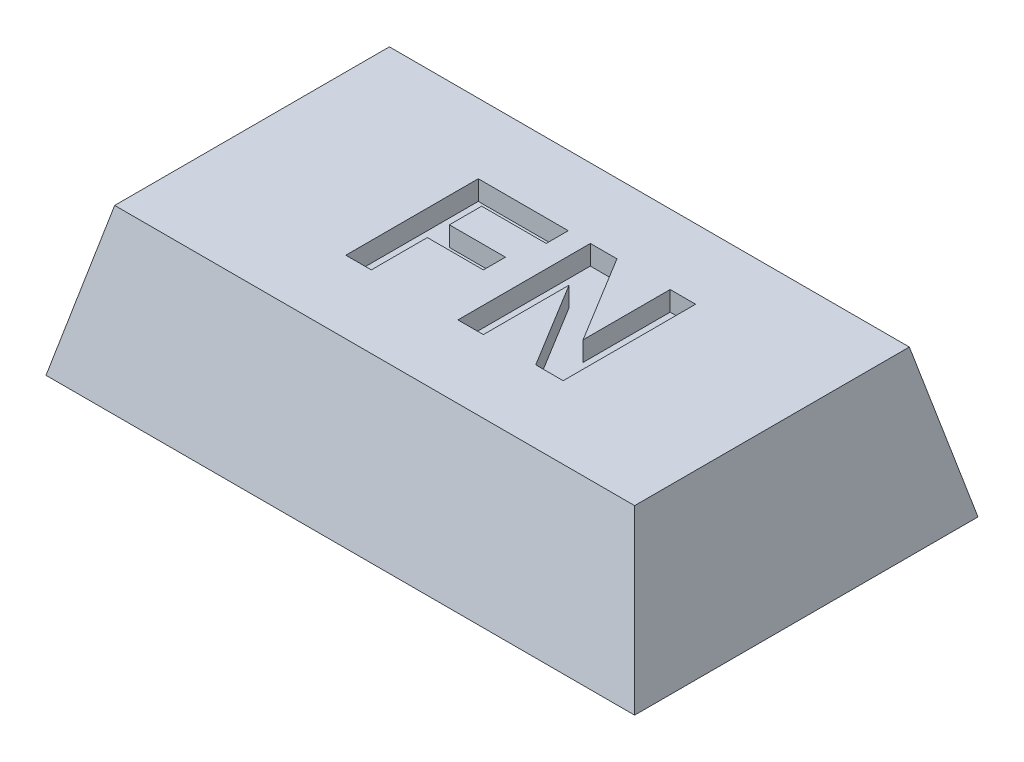
ISO-10303-21;
HEADER;
FILE_DESCRIPTION(('STEP AP214'),'2;1');
FILE_NAME('part.step','',(''),(''),'','','');
FILE_SCHEMA(('AUTOMOTIVE_DESIGN { 1 0 10303 214 1 1 1 1 }'));
ENDSEC;
DATA;
#1=APPLICATION_CONTEXT('core data for automotive mechanical design processes');
#2=APPLICATION_PROTOCOL_DEFINITION('international standard','automotive_design',2000,#1);
#3=PRODUCT_CONTEXT('',#1,'mechanical');
#4=PRODUCT('Part','Part','',(#3));
#5=PRODUCT_RELATED_PRODUCT_CATEGORY('part','',(#4));
#6=PRODUCT_DEFINITION_FORMATION('','',#4);
#7=PRODUCT_DEFINITION_CONTEXT('part definition',#1,'design');
#8=PRODUCT_DEFINITION('design','',#6,#7);
#9=PRODUCT_DEFINITION_SHAPE('','',#8);
#10=(LENGTH_UNIT() NAMED_UNIT(*) SI_UNIT(.MILLI.,.METRE.));
#11=(NAMED_UNIT(*) PLANE_ANGLE_UNIT() SI_UNIT($,.RADIAN.));
#12=(NAMED_UNIT(*) SI_UNIT($,.STERADIAN.) SOLID_ANGLE_UNIT());
#13=UNCERTAINTY_MEASURE_WITH_UNIT(LENGTH_MEASURE(1.E-05),#10,'distance_accuracy_value','');
#14=(GEOMETRIC_REPRESENTATION_CONTEXT(3) GLOBAL_UNCERTAINTY_ASSIGNED_CONTEXT((#13)) GLOBAL_UNIT_ASSIGNED_CONTEXT((#10,
#11,#12)) REPRESENTATION_CONTEXT('',''));
#15=CARTESIAN_POINT('',(0.,0.,0.));
#16=DIRECTION('',(0.,0.,1.));
#17=DIRECTION('',(1.,0.,0.));
#18=AXIS2_PLACEMENT_3D('',#15,#16,#17);
#19=CARTESIAN_POINT('',(0.,3.,0.));
#20=DIRECTION('',(0.,-1.,0.));
#21=DIRECTION('',(0.,0.,-1.));
#22=AXIS2_PLACEMENT_3D('',#19,#20,#21);
#23=PLANE('',#22);
#24=DIRECTION('',(-1.,0.,0.));
#25=VECTOR('',#24,1.);
#26=CARTESIAN_POINT('',(6.73909856678766,3.,-2.17723437301805));
#27=LINE('',#26,#25);
#28=CARTESIAN_POINT('',(6.73909856678766,3.,-2.17723437301805));
#29=VERTEX_POINT('',#28);
#30=CARTESIAN_POINT('',(6.21986779755689,3.,-2.17723437301805));
#31=VERTEX_POINT('',#30);
#32=EDGE_CURVE('E69',#29,#31,#27,.T.);
#33=ORIENTED_EDGE('',*,*,#32,.T.);
#34=DIRECTION('',(0.,0.,-1.));
#35=VECTOR('',#34,1.);
#36=CARTESIAN_POINT('',(6.21986779755689,3.,-2.17723437301805));
#37=LINE('',#36,#35);
#38=CARTESIAN_POINT('',(6.21986779755689,3.,-4.87723437301805));
#39=VERTEX_POINT('',#38);
#40=EDGE_CURVE('E308',#31,#39,#37,.T.);
#41=ORIENTED_EDGE('',*,*,#40,.T.);
#42=DIRECTION('',(1.,0.,0.));
#43=VECTOR('',#42,1.);
#44=CARTESIAN_POINT('',(6.21986779755689,3.,-4.87723437301805));
#45=LINE('',#44,#43);
#46=CARTESIAN_POINT('',(6.76235577832612,3.,-4.87723437301805));
#47=VERTEX_POINT('',#46);
#48=EDGE_CURVE('E304',#39,#47,#45,.T.);
#49=ORIENTED_EDGE('',*,*,#48,.T.);
#50=DIRECTION('',(0.521323795742144,0.,0.853358951434274));
#51=VECTOR('',#50,1.);
#52=CARTESIAN_POINT('',(6.76235577832612,3.,-4.87723437301805));
#53=LINE('',#52,#51);
#54=CARTESIAN_POINT('',(7.84679087447997,3.,-3.10211418071036));
#55=VERTEX_POINT('',#54);
#56=EDGE_CURVE('E300',#47,#55,#53,.T.);
#57=ORIENTED_EDGE('',*,*,#56,.T.);
#58=DIRECTION('',(0.,0.,-1.));
#59=VECTOR('',#58,1.);
#60=CARTESIAN_POINT('',(7.84679087447997,3.,-3.10211418071036));
#61=LINE('',#60,#59);
#62=CARTESIAN_POINT('',(7.84679087447997,3.,-4.87723437301805));
#63=VERTEX_POINT('',#62);
#64=EDGE_CURVE('E296',#55,#63,#61,.T.);
#65=ORIENTED_EDGE('',*,*,#64,.T.);
#66=DIRECTION('',(1.,0.,0.));
#67=VECTOR('',#66,1.);
#68=CARTESIAN_POINT('',(7.84679087447997,3.,-4.87723437301805));
#69=LINE('',#68,#67);
#70=CARTESIAN_POINT('',(8.36602164371074,3.,-4.87723437301805));
#71=VERTEX_POINT('',#70);
#72=EDGE_CURVE('E292',#63,#71,#69,.T.);
#73=ORIENTED_EDGE('',*,*,#72,.T.);
#74=DIRECTION('',(0.,0.,1.));
#75=VECTOR('',#74,1.);
#76=CARTESIAN_POINT('',(8.36602164371074,3.,-4.87723437301805));
#77=LINE('',#76,#75);
#78=CARTESIAN_POINT('',(8.36602164371074,3.,-2.17723437301805));
#79=VERTEX_POINT('',#78);
#80=EDGE_CURVE('E288',#71,#79,#77,.T.);
#81=ORIENTED_EDGE('',*,*,#80,.T.);
#82=DIRECTION('',(-1.,0.,0.));
#83=VECTOR('',#82,1.);
#84=CARTESIAN_POINT('',(8.36602164371074,3.,-2.17723437301805));
#85=LINE('',#84,#83);
#86=CARTESIAN_POINT('',(7.80676683601843,3.,-2.17723437301805));
#87=VERTEX_POINT('',#86);
#88=EDGE_CURVE('E284',#79,#87,#85,.T.);
#89=ORIENTED_EDGE('',*,*,#88,.T.);
#90=DIRECTION('',(-0.521471380338423,0.,-0.853268773299445));
#91=VECTOR('',#90,1.);
#92=CARTESIAN_POINT('',(7.80676683601843,3.,-2.17723437301805));
#93=LINE('',#92,#91);
#94=CARTESIAN_POINT('',(6.73909856678766,3.,-3.92422956532575));
#95=VERTEX_POINT('',#94);
#96=EDGE_CURVE('E279',#87,#95,#93,.T.);
#97=ORIENTED_EDGE('',*,*,#96,.T.);
#98=DIRECTION('',(0.,0.,1.));
#99=VECTOR('',#98,1.);
#100=CARTESIAN_POINT('',(6.73909856678766,3.,-3.92422956532575));
#101=LINE('',#100,#99);
#102=EDGE_CURVE('E275',#95,#29,#101,.T.);
#103=ORIENTED_EDGE('',*,*,#102,.T.);
#104=EDGE_LOOP('',(#33,#41,#49,#57,#65,#73,#81,#89,#97,#103));
#105=FACE_BOUND('',#104,.T.);
#106=DIRECTION('',(-1.,0.,0.));
#107=VECTOR('',#106,1.);
#108=CARTESIAN_POINT('',(12.,3.,-0.7));
#109=LINE('',#108,#107);
#110=CARTESIAN_POINT('',(11.3,3.,-0.7));
#111=VERTEX_POINT('',#110);
#112=CARTESIAN_POINT('',(0.7,3.,-0.7));
#113=VERTEX_POINT('',#112);
#114=EDGE_CURVE('E347',#111,#113,#109,.T.);
#115=ORIENTED_EDGE('',*,*,#114,.F.);
#116=DIRECTION('',(0.,0.,1.));
#117=VECTOR('',#116,1.);
#118=CARTESIAN_POINT('',(11.3,3.,-7.));
#119=LINE('',#118,#117);
#120=CARTESIAN_POINT('',(11.3,3.,-6.3));
#121=VERTEX_POINT('',#120);
#122=EDGE_CURVE('E359',#121,#111,#119,.T.);
#123=ORIENTED_EDGE('',*,*,#122,.F.);
#124=DIRECTION('',(-1.,0.,0.));
#125=VECTOR('',#124,1.);
#126=CARTESIAN_POINT('',(12.,3.,-6.3));
#127=LINE('',#126,#125);
#128=CARTESIAN_POINT('',(0.700000000000001,3.,-6.3));
#129=VERTEX_POINT('',#128);
#130=EDGE_CURVE('E345',#121,#129,#127,.T.);
#131=ORIENTED_EDGE('',*,*,#130,.T.);
#132=DIRECTION('',(0.,0.,1.));
#133=VECTOR('',#132,1.);
#134=CARTESIAN_POINT('',(0.7,3.,-7.));
#135=LINE('',#134,#133);
#136=EDGE_CURVE('E360',#129,#113,#135,.T.);
#137=ORIENTED_EDGE('',*,*,#136,.T.);
#138=EDGE_LOOP('',(#115,#123,#131,#137));
#139=FACE_BOUND('',#138,.T.);
#140=DIRECTION('',(-1.,0.,0.));
#141=VECTOR('',#140,1.);
#142=CARTESIAN_POINT('',(4.45448318217228,3.,-2.17723437301805));
#143=LINE('',#142,#141);
#144=CARTESIAN_POINT('',(4.45448318217228,3.,-2.17723437301805));
#145=VERTEX_POINT('',#144);
#146=CARTESIAN_POINT('',(3.93525241294151,3.,-2.17723437301805));
#147=VERTEX_POINT('',#146);
#148=EDGE_CURVE('E61',#145,#147,#143,.T.);
#149=ORIENTED_EDGE('',*,*,#148,.T.);
#150=DIRECTION('',(0.,0.,-1.));
#151=VECTOR('',#150,1.);
#152=CARTESIAN_POINT('',(3.93525241294151,3.,-2.17723437301805));
#153=LINE('',#152,#151);
#154=CARTESIAN_POINT('',(3.93525241294151,3.,-4.87723437301805));
#155=VERTEX_POINT('',#154);
#156=EDGE_CURVE('E230',#147,#155,#153,.T.);
#157=ORIENTED_EDGE('',*,*,#156,.T.);
#158=DIRECTION('',(1.,0.,0.));
#159=VECTOR('',#158,1.);
#160=CARTESIAN_POINT('',(3.93525241294151,3.,-4.87723437301805));
#161=LINE('',#160,#159);
#162=CARTESIAN_POINT('',(5.76986779755689,3.,-4.87723437301805));
#163=VERTEX_POINT('',#162);
#164=EDGE_CURVE('E420',#155,#163,#161,.T.);
#165=ORIENTED_EDGE('',*,*,#164,.T.);
#166=DIRECTION('',(0.,0.,1.));
#167=VECTOR('',#166,1.);
#168=CARTESIAN_POINT('',(5.76986779755689,3.,-4.87723437301805));
#169=LINE('',#168,#167);
#170=CARTESIAN_POINT('',(5.76986779755689,3.,-4.42723437301805));
#171=VERTEX_POINT('',#170);
#172=EDGE_CURVE('E428',#163,#171,#169,.T.);
#173=ORIENTED_EDGE('',*,*,#172,.T.);
#174=DIRECTION('',(-1.,0.,0.));
#175=VECTOR('',#174,1.);
#176=CARTESIAN_POINT('',(5.76986779755689,3.,-4.42723437301805));
#177=LINE('',#176,#175);
#178=CARTESIAN_POINT('',(4.45448318217228,3.,-4.42723437301805));
#179=VERTEX_POINT('',#178);
#180=EDGE_CURVE('E432',#171,#179,#177,.T.);
#181=ORIENTED_EDGE('',*,*,#180,.T.);
#182=DIRECTION('',(0.,0.,1.));
#183=VECTOR('',#182,1.);
#184=CARTESIAN_POINT('',(4.45448318217228,3.,-4.42723437301805));
#185=LINE('',#184,#183);
#186=CARTESIAN_POINT('',(4.45448318217228,3.,-3.76954206532575));
#187=VERTEX_POINT('',#186);
#188=EDGE_CURVE('E436',#179,#187,#185,.T.);
#189=ORIENTED_EDGE('',*,*,#188,.T.);
#190=DIRECTION('',(1.,0.,0.));
#191=VECTOR('',#190,1.);
#192=CARTESIAN_POINT('',(4.45448318217228,3.,-3.76954206532575));
#193=LINE('',#192,#191);
#194=CARTESIAN_POINT('',(5.59679087447997,3.,-3.76954206532575));
#195=VERTEX_POINT('',#194);
#196=EDGE_CURVE('E440',#187,#195,#193,.T.);
#197=ORIENTED_EDGE('',*,*,#196,.T.);
#198=DIRECTION('',(0.,0.,1.));
#199=VECTOR('',#198,1.);
#200=CARTESIAN_POINT('',(5.59679087447997,3.,-3.76954206532575));
#201=LINE('',#200,#199);
#202=CARTESIAN_POINT('',(5.59679087447997,3.,-3.31954206532575));
#203=VERTEX_POINT('',#202);
#204=EDGE_CURVE('E444',#195,#203,#201,.T.);
#205=ORIENTED_EDGE('',*,*,#204,.T.);
#206=DIRECTION('',(-1.,0.,0.));
#207=VECTOR('',#206,1.);
#208=CARTESIAN_POINT('',(5.59679087447997,3.,-3.31954206532575));
#209=LINE('',#208,#207);
#210=CARTESIAN_POINT('',(4.45448318217228,3.,-3.31954206532575));
#211=VERTEX_POINT('',#210);
#212=EDGE_CURVE('E448',#203,#211,#209,.T.);
#213=ORIENTED_EDGE('',*,*,#212,.T.);
#214=DIRECTION('',(0.,0.,1.));
#215=VECTOR('',#214,1.);
#216=CARTESIAN_POINT('',(4.45448318217228,3.,-3.31954206532575));
#217=LINE('',#216,#215);
#218=EDGE_CURVE('E226',#211,#145,#217,.T.);
#219=ORIENTED_EDGE('',*,*,#218,.T.);
#220=EDGE_LOOP('',(#149,#157,#165,#173,#181,#189,#197,#205,#213,#219));
#221=FACE_BOUND('',#220,.T.);
#222=ADVANCED_FACE('F43',(#105,#139,#221),#23,.F.);
#223=CARTESIAN_POINT('',(12.,0.,-7.));
#224=DIRECTION('',(-0.973841209741793,-0.227229615606418,0.));
#225=DIRECTION('',(0.227229615606418,-0.973841209741793,0.));
#226=AXIS2_PLACEMENT_3D('',#223,#224,#225);
#227=PLANE('',#226);
#228=DIRECTION('',(-0.221581128241521,0.949633406749378,-0.221581128241521));
#229=VECTOR('',#228,1.);
#230=CARTESIAN_POINT('',(11.6563126252505,1.47294589178357,-0.3436873747495));
#231=LINE('',#230,#229);
#232=CARTESIAN_POINT('',(12.,0.,0.));
#233=VERTEX_POINT('',#232);
#234=EDGE_CURVE('E356',#233,#111,#231,.T.);
#235=ORIENTED_EDGE('',*,*,#234,.F.);
#236=DIRECTION('',(0.,0.,-1.));
#237=VECTOR('',#236,1.);
#238=CARTESIAN_POINT('',(12.,0.,0.));
#239=LINE('',#238,#237);
#240=CARTESIAN_POINT('',(12.,0.,-7.));
#241=VERTEX_POINT('',#240);
#242=EDGE_CURVE('E368',#233,#241,#239,.T.);
#243=ORIENTED_EDGE('',*,*,#242,.T.);
#244=DIRECTION('',(0.221581128241521,-0.949633406749378,-0.221581128241521));
#245=VECTOR('',#244,1.);
#246=CARTESIAN_POINT('',(12.,0.,-7.));
#247=LINE('',#246,#245);
#248=EDGE_CURVE('E350',#121,#241,#247,.T.);
#249=ORIENTED_EDGE('',*,*,#248,.F.);
#250=ORIENTED_EDGE('',*,*,#122,.T.);
#251=EDGE_LOOP('',(#235,#243,#249,#250));
#252=FACE_BOUND('',#251,.T.);
#253=ADVANCED_FACE('F399',(#252),#227,.F.);
#254=CARTESIAN_POINT('',(0.,0.,-7.));
#255=DIRECTION('',(0.973841209741793,-0.227229615606418,0.));
#256=DIRECTION('',(0.227229615606418,0.973841209741793,0.));
#257=AXIS2_PLACEMENT_3D('',#254,#255,#256);
#258=PLANE('',#257);
#259=DIRECTION('',(-0.221581128241521,-0.949633406749378,0.221581128241521));
#260=VECTOR('',#259,1.);
#261=CARTESIAN_POINT('',(0.343687374749499,1.47294589178357,-0.3436873747495));
#262=LINE('',#261,#260);
#263=CARTESIAN_POINT('',(-6.E-06,0.,0.));
#264=VERTEX_POINT('',#263);
#265=EDGE_CURVE('E11',#113,#264,#262,.T.);
#266=ORIENTED_EDGE('',*,*,#265,.F.);
#267=ORIENTED_EDGE('',*,*,#136,.F.);
#268=DIRECTION('',(0.221581128241521,0.949633406749378,0.221581128241521));
#269=VECTOR('',#268,1.);
#270=CARTESIAN_POINT('',(0.,0.,-7.));
#271=LINE('',#270,#269);
#272=CARTESIAN_POINT('',(0.,0.,-7.));
#273=VERTEX_POINT('',#272);
#274=EDGE_CURVE('E53',#273,#129,#271,.T.);
#275=ORIENTED_EDGE('',*,*,#274,.F.);
#276=DIRECTION('',(0.,0.,1.));
#277=VECTOR('',#276,1.);
#278=CARTESIAN_POINT('',(0.,0.,0.));
#279=LINE('',#278,#277);
#280=EDGE_CURVE('E364',#273,#264,#279,.T.);
#281=ORIENTED_EDGE('',*,*,#280,.T.);
#282=EDGE_LOOP('',(#266,#267,#275,#281));
#283=FACE_BOUND('',#282,.T.);
#284=ADVANCED_FACE('F408',(#283),#258,.F.);
#285=CARTESIAN_POINT('',(0.,0.,0.));
#286=DIRECTION('',(0.,-1.,0.));
#287=DIRECTION('',(0.,0.,-1.));
#288=AXIS2_PLACEMENT_3D('',#285,#286,#287);
#289=PLANE('',#288);
#290=CARTESIAN_POINT('',(6.,0.,-3.5));
#291=DIRECTION('',(0.,-1.,0.));
#292=DIRECTION('',(0.,0.,-1.));
#293=AXIS2_PLACEMENT_3D('',#290,#291,#292);
#294=CIRCLE('',#293,1.8);
#295=CARTESIAN_POINT('',(6.,0.,-5.3));
#296=VERTEX_POINT('',#295);
#297=EDGE_CURVE('E232',#296,#296,#294,.T.);
#298=ORIENTED_EDGE('',*,*,#297,.F.);
#299=EDGE_LOOP('',(#298));
#300=FACE_BOUND('',#299,.T.);
#301=ORIENTED_EDGE('',*,*,#280,.F.);
#302=DIRECTION('',(-1.,0.,0.));
#303=VECTOR('',#302,1.);
#304=CARTESIAN_POINT('',(0.,0.,-7.));
#305=LINE('',#304,#303);
#306=EDGE_CURVE('E372',#241,#273,#305,.T.);
#307=ORIENTED_EDGE('',*,*,#306,.F.);
#308=ORIENTED_EDGE('',*,*,#242,.F.);
#309=DIRECTION('',(1.,0.,0.));
#310=VECTOR('',#309,1.);
#311=CARTESIAN_POINT('',(0.,0.,0.));
#312=LINE('',#311,#310);
#313=EDGE_CURVE('E373',#264,#233,#312,.T.);
#314=ORIENTED_EDGE('',*,*,#313,.F.);
#315=EDGE_LOOP('',(#301,#307,#308,#314));
#316=FACE_BOUND('',#315,.T.);
#317=ADVANCED_FACE('F45',(#300,#316),#289,.T.);
#318=CARTESIAN_POINT('',(12.,3.,-6.3));
#319=DIRECTION('',(0.,0.227229615606418,-0.973841209741793));
#320=DIRECTION('',(0.,0.973841209741793,0.227229615606418));
#321=AXIS2_PLACEMENT_3D('',#318,#319,#320);
#322=PLANE('',#321);
#323=ORIENTED_EDGE('',*,*,#248,.T.);
#324=ORIENTED_EDGE('',*,*,#306,.T.);
#325=ORIENTED_EDGE('',*,*,#274,.T.);
#326=ORIENTED_EDGE('',*,*,#130,.F.);
#327=EDGE_LOOP('',(#323,#324,#325,#326));
#328=FACE_BOUND('',#327,.T.);
#329=ADVANCED_FACE('F405',(#328),#322,.T.);
#330=CARTESIAN_POINT('',(12.,0.,0.));
#331=DIRECTION('',(0.,0.227229615606418,0.973841209741793));
#332=DIRECTION('',(0.,-0.973841209741793,0.227229615606418));
#333=AXIS2_PLACEMENT_3D('',#330,#331,#332);
#334=PLANE('',#333);
#335=ORIENTED_EDGE('',*,*,#234,.T.);
#336=ORIENTED_EDGE('',*,*,#114,.T.);
#337=ORIENTED_EDGE('',*,*,#265,.T.);
#338=ORIENTED_EDGE('',*,*,#313,.T.);
#339=EDGE_LOOP('',(#335,#336,#337,#338));
#340=FACE_BOUND('',#339,.T.);
#341=ADVANCED_FACE('F392',(#340),#334,.T.);
#342=CARTESIAN_POINT('',(6.,0.8,-3.5));
#343=DIRECTION('',(0.,-1.,0.));
#344=DIRECTION('',(0.,0.,-1.));
#345=AXIS2_PLACEMENT_3D('',#342,#343,#344);
#346=CYLINDRICAL_SURFACE('',#345,1.8);
#347=CARTESIAN_POINT('',(6.,0.8,-3.5));
#348=DIRECTION('',(0.,-1.,0.));
#349=DIRECTION('',(0.,0.,-1.));
#350=AXIS2_PLACEMENT_3D('',#347,#348,#349);
#351=CIRCLE('',#350,1.8);
#352=CARTESIAN_POINT('',(6.,0.8,-5.3));
#353=VERTEX_POINT('',#352);
#354=EDGE_CURVE('E238',#353,#353,#351,.T.);
#355=ORIENTED_EDGE('',*,*,#354,.F.);
#356=EDGE_LOOP('',(#355));
#357=FACE_BOUND('',#356,.T.);
#358=ORIENTED_EDGE('',*,*,#297,.T.);
#359=EDGE_LOOP('',(#358));
#360=FACE_BOUND('',#359,.T.);
#361=ADVANCED_FACE('F599',(#357,#360),#346,.F.);
#362=CARTESIAN_POINT('',(6.,0.8,-3.5));
#363=DIRECTION('',(0.,-1.,0.));
#364=DIRECTION('',(0.,0.,-1.));
#365=AXIS2_PLACEMENT_3D('',#362,#363,#364);
#366=PLANE('',#365);
#367=ORIENTED_EDGE('',*,*,#354,.T.);
#368=EDGE_LOOP('',(#367));
#369=FACE_BOUND('',#368,.T.);
#370=ADVANCED_FACE('F558',(#369),#366,.T.);
#371=CARTESIAN_POINT('',(6.73909856678766,2.6,-2.17723437301805));
#372=DIRECTION('',(0.,0.,-1.));
#373=DIRECTION('',(-1.,0.,0.));
#374=AXIS2_PLACEMENT_3D('',#371,#372,#373);
#375=PLANE('',#374);
#376=ORIENTED_EDGE('',*,*,#32,.F.);
#377=DIRECTION('',(0.,1.,0.));
#378=VECTOR('',#377,1.);
#379=CARTESIAN_POINT('',(6.73909856678766,2.6,-2.17723437301805));
#380=LINE('',#379,#378);
#381=CARTESIAN_POINT('',(6.73909856678766,2.6,-2.17723437301805));
#382=VERTEX_POINT('',#381);
#383=EDGE_CURVE('E271',#382,#29,#380,.T.);
#384=ORIENTED_EDGE('',*,*,#383,.F.);
#385=DIRECTION('',(-1.,0.,0.));
#386=VECTOR('',#385,1.);
#387=CARTESIAN_POINT('',(6.73909856678766,2.6,-2.17723437301805));
#388=LINE('',#387,#386);
#389=CARTESIAN_POINT('',(6.21986779755689,2.6,-2.17723437301805));
#390=VERTEX_POINT('',#389);
#391=EDGE_CURVE('E280',#382,#390,#388,.T.);
#392=ORIENTED_EDGE('',*,*,#391,.T.);
#393=DIRECTION('',(0.,1.,0.));
#394=VECTOR('',#393,1.);
#395=CARTESIAN_POINT('',(6.21986779755689,2.6,-2.17723437301805));
#396=LINE('',#395,#394);
#397=EDGE_CURVE('E244',#390,#31,#396,.T.);
#398=ORIENTED_EDGE('',*,*,#397,.T.);
#399=EDGE_LOOP('',(#376,#384,#392,#398));
#400=FACE_BOUND('',#399,.T.);
#401=ADVANCED_FACE('F554',(#400),#375,.T.);
#402=CARTESIAN_POINT('',(6.21986779755689,2.6,-2.17723437301805));
#403=DIRECTION('',(1.,0.,0.));
#404=DIRECTION('',(0.,0.,-1.));
#405=AXIS2_PLACEMENT_3D('',#402,#403,#404);
#406=PLANE('',#405);
#407=ORIENTED_EDGE('',*,*,#40,.F.);
#408=ORIENTED_EDGE('',*,*,#397,.F.);
#409=DIRECTION('',(0.,0.,-1.));
#410=VECTOR('',#409,1.);
#411=CARTESIAN_POINT('',(6.21986779755689,2.6,-2.17723437301805));
#412=LINE('',#411,#410);
#413=CARTESIAN_POINT('',(6.21986779755689,2.6,-4.87723437301805));
#414=VERTEX_POINT('',#413);
#415=EDGE_CURVE('E337',#390,#414,#412,.T.);
#416=ORIENTED_EDGE('',*,*,#415,.T.);
#417=DIRECTION('',(0.,1.,0.));
#418=VECTOR('',#417,1.);
#419=CARTESIAN_POINT('',(6.21986779755689,2.6,-4.87723437301805));
#420=LINE('',#419,#418);
#421=EDGE_CURVE('E247',#414,#39,#420,.T.);
#422=ORIENTED_EDGE('',*,*,#421,.T.);
#423=EDGE_LOOP('',(#407,#408,#416,#422));
#424=FACE_BOUND('',#423,.T.);
#425=ADVANCED_FACE('F557',(#424),#406,.T.);
#426=CARTESIAN_POINT('',(6.21986779755689,2.6,-4.87723437301805));
#427=DIRECTION('',(0.,0.,1.));
#428=DIRECTION('',(1.,0.,0.));
#429=AXIS2_PLACEMENT_3D('',#426,#427,#428);
#430=PLANE('',#429);
#431=ORIENTED_EDGE('',*,*,#48,.F.);
#432=ORIENTED_EDGE('',*,*,#421,.F.);
#433=DIRECTION('',(1.,0.,0.));
#434=VECTOR('',#433,1.);
#435=CARTESIAN_POINT('',(6.21986779755689,2.6,-4.87723437301805));
#436=LINE('',#435,#434);
#437=CARTESIAN_POINT('',(6.76235577832612,2.6,-4.87723437301805));
#438=VERTEX_POINT('',#437);
#439=EDGE_CURVE('E334',#414,#438,#436,.T.);
#440=ORIENTED_EDGE('',*,*,#439,.T.);
#441=DIRECTION('',(0.,1.,0.));
#442=VECTOR('',#441,1.);
#443=CARTESIAN_POINT('',(6.76235577832612,2.6,-4.87723437301805));
#444=LINE('',#443,#442);
#445=EDGE_CURVE('E250',#438,#47,#444,.T.);
#446=ORIENTED_EDGE('',*,*,#445,.T.);
#447=EDGE_LOOP('',(#431,#432,#440,#446));
#448=FACE_BOUND('',#447,.T.);
#449=ADVANCED_FACE('F561',(#448),#430,.T.);
#450=CARTESIAN_POINT('',(6.76235577832612,2.6,-4.87723437301805));
#451=DIRECTION('',(-0.853358951434274,0.,0.521323795742145));
#452=DIRECTION('',(0.521323795742145,0.,0.853358951434274));
#453=AXIS2_PLACEMENT_3D('',#450,#451,#452);
#454=PLANE('',#453);
#455=ORIENTED_EDGE('',*,*,#56,.F.);
#456=ORIENTED_EDGE('',*,*,#445,.F.);
#457=DIRECTION('',(0.521323795742144,0.,0.853358951434274));
#458=VECTOR('',#457,1.);
#459=CARTESIAN_POINT('',(6.76235577832612,2.6,-4.87723437301805));
#460=LINE('',#459,#458);
#461=CARTESIAN_POINT('',(7.84679087447997,2.6,-3.10211418071036));
#462=VERTEX_POINT('',#461);
#463=EDGE_CURVE('E331',#438,#462,#460,.T.);
#464=ORIENTED_EDGE('',*,*,#463,.T.);
#465=DIRECTION('',(0.,1.,0.));
#466=VECTOR('',#465,1.);
#467=CARTESIAN_POINT('',(7.84679087447997,2.6,-3.10211418071036));
#468=LINE('',#467,#466);
#469=EDGE_CURVE('E253',#462,#55,#468,.T.);
#470=ORIENTED_EDGE('',*,*,#469,.T.);
#471=EDGE_LOOP('',(#455,#456,#464,#470));
#472=FACE_BOUND('',#471,.T.);
#473=ADVANCED_FACE('F565',(#472),#454,.T.);
#474=CARTESIAN_POINT('',(7.84679087447997,2.6,-3.10211418071036));
#475=DIRECTION('',(1.,0.,0.));
#476=DIRECTION('',(0.,0.,-1.));
#477=AXIS2_PLACEMENT_3D('',#474,#475,#476);
#478=PLANE('',#477);
#479=ORIENTED_EDGE('',*,*,#64,.F.);
#480=ORIENTED_EDGE('',*,*,#469,.F.);
#481=DIRECTION('',(0.,0.,-1.));
#482=VECTOR('',#481,1.);
#483=CARTESIAN_POINT('',(7.84679087447997,2.6,-3.10211418071036));
#484=LINE('',#483,#482);
#485=CARTESIAN_POINT('',(7.84679087447997,2.6,-4.87723437301805));
#486=VERTEX_POINT('',#485);
#487=EDGE_CURVE('E328',#462,#486,#484,.T.);
#488=ORIENTED_EDGE('',*,*,#487,.T.);
#489=DIRECTION('',(0.,1.,0.));
#490=VECTOR('',#489,1.);
#491=CARTESIAN_POINT('',(7.84679087447997,2.6,-4.87723437301805));
#492=LINE('',#491,#490);
#493=EDGE_CURVE('E256',#486,#63,#492,.T.);
#494=ORIENTED_EDGE('',*,*,#493,.T.);
#495=EDGE_LOOP('',(#479,#480,#488,#494));
#496=FACE_BOUND('',#495,.T.);
#497=ADVANCED_FACE('F569',(#496),#478,.T.);
#498=CARTESIAN_POINT('',(7.84679087447997,2.6,-4.87723437301805));
#499=DIRECTION('',(0.,0.,1.));
#500=DIRECTION('',(1.,0.,0.));
#501=AXIS2_PLACEMENT_3D('',#498,#499,#500);
#502=PLANE('',#501);
#503=ORIENTED_EDGE('',*,*,#72,.F.);
#504=ORIENTED_EDGE('',*,*,#493,.F.);
#505=DIRECTION('',(1.,0.,0.));
#506=VECTOR('',#505,1.);
#507=CARTESIAN_POINT('',(7.84679087447997,2.6,-4.87723437301805));
#508=LINE('',#507,#506);
#509=CARTESIAN_POINT('',(8.36602164371074,2.6,-4.87723437301805));
#510=VERTEX_POINT('',#509);
#511=EDGE_CURVE('E325',#486,#510,#508,.T.);
#512=ORIENTED_EDGE('',*,*,#511,.T.);
#513=DIRECTION('',(0.,1.,0.));
#514=VECTOR('',#513,1.);
#515=CARTESIAN_POINT('',(8.36602164371074,2.6,-4.87723437301805));
#516=LINE('',#515,#514);
#517=EDGE_CURVE('E259',#510,#71,#516,.T.);
#518=ORIENTED_EDGE('',*,*,#517,.T.);
#519=EDGE_LOOP('',(#503,#504,#512,#518));
#520=FACE_BOUND('',#519,.T.);
#521=ADVANCED_FACE('F573',(#520),#502,.T.);
#522=CARTESIAN_POINT('',(8.36602164371074,2.6,-4.87723437301805));
#523=DIRECTION('',(-1.,0.,0.));
#524=DIRECTION('',(0.,0.,1.));
#525=AXIS2_PLACEMENT_3D('',#522,#523,#524);
#526=PLANE('',#525);
#527=ORIENTED_EDGE('',*,*,#80,.F.);
#528=ORIENTED_EDGE('',*,*,#517,.F.);
#529=DIRECTION('',(0.,0.,1.));
#530=VECTOR('',#529,1.);
#531=CARTESIAN_POINT('',(8.36602164371074,2.6,-4.87723437301805));
#532=LINE('',#531,#530);
#533=CARTESIAN_POINT('',(8.36602164371074,2.6,-2.17723437301805));
#534=VERTEX_POINT('',#533);
#535=EDGE_CURVE('E322',#510,#534,#532,.T.);
#536=ORIENTED_EDGE('',*,*,#535,.T.);
#537=DIRECTION('',(0.,1.,0.));
#538=VECTOR('',#537,1.);
#539=CARTESIAN_POINT('',(8.36602164371074,2.6,-2.17723437301805));
#540=LINE('',#539,#538);
#541=EDGE_CURVE('E262',#534,#79,#540,.T.);
#542=ORIENTED_EDGE('',*,*,#541,.T.);
#543=EDGE_LOOP('',(#527,#528,#536,#542));
#544=FACE_BOUND('',#543,.T.);
#545=ADVANCED_FACE('F577',(#544),#526,.T.);
#546=CARTESIAN_POINT('',(8.36602164371074,2.6,-2.17723437301805));
#547=DIRECTION('',(0.,0.,-1.));
#548=DIRECTION('',(-1.,0.,0.));
#549=AXIS2_PLACEMENT_3D('',#546,#547,#548);
#550=PLANE('',#549);
#551=ORIENTED_EDGE('',*,*,#88,.F.);
#552=ORIENTED_EDGE('',*,*,#541,.F.);
#553=DIRECTION('',(-1.,0.,0.));
#554=VECTOR('',#553,1.);
#555=CARTESIAN_POINT('',(8.36602164371074,2.6,-2.17723437301805));
#556=LINE('',#555,#554);
#557=CARTESIAN_POINT('',(7.80676683601843,2.6,-2.17723437301805));
#558=VERTEX_POINT('',#557);
#559=EDGE_CURVE('E319',#534,#558,#556,.T.);
#560=ORIENTED_EDGE('',*,*,#559,.T.);
#561=DIRECTION('',(0.,1.,0.));
#562=VECTOR('',#561,1.);
#563=CARTESIAN_POINT('',(7.80676683601843,2.6,-2.17723437301805));
#564=LINE('',#563,#562);
#565=EDGE_CURVE('E265',#558,#87,#564,.T.);
#566=ORIENTED_EDGE('',*,*,#565,.T.);
#567=EDGE_LOOP('',(#551,#552,#560,#566));
#568=FACE_BOUND('',#567,.T.);
#569=ADVANCED_FACE('F581',(#568),#550,.T.);
#570=CARTESIAN_POINT('',(7.80676683601843,2.6,-2.17723437301805));
#571=DIRECTION('',(0.853268773299445,0.,-0.521471380338423));
#572=DIRECTION('',(-0.521471380338423,0.,-0.853268773299445));
#573=AXIS2_PLACEMENT_3D('',#570,#571,#572);
#574=PLANE('',#573);
#575=ORIENTED_EDGE('',*,*,#96,.F.);
#576=ORIENTED_EDGE('',*,*,#565,.F.);
#577=DIRECTION('',(-0.521471380338423,0.,-0.853268773299445));
#578=VECTOR('',#577,1.);
#579=CARTESIAN_POINT('',(7.80676683601843,2.6,-2.17723437301805));
#580=LINE('',#579,#578);
#581=CARTESIAN_POINT('',(6.73909856678766,2.6,-3.92422956532575));
#582=VERTEX_POINT('',#581);
#583=EDGE_CURVE('E316',#558,#582,#580,.T.);
#584=ORIENTED_EDGE('',*,*,#583,.T.);
#585=DIRECTION('',(0.,1.,0.));
#586=VECTOR('',#585,1.);
#587=CARTESIAN_POINT('',(6.73909856678766,2.6,-3.92422956532575));
#588=LINE('',#587,#586);
#589=EDGE_CURVE('E268',#582,#95,#588,.T.);
#590=ORIENTED_EDGE('',*,*,#589,.T.);
#591=EDGE_LOOP('',(#575,#576,#584,#590));
#592=FACE_BOUND('',#591,.T.);
#593=ADVANCED_FACE('F585',(#592),#574,.T.);
#594=CARTESIAN_POINT('',(6.73909856678766,2.6,-3.92422956532575));
#595=DIRECTION('',(-1.,0.,0.));
#596=DIRECTION('',(0.,0.,1.));
#597=AXIS2_PLACEMENT_3D('',#594,#595,#596);
#598=PLANE('',#597);
#599=ORIENTED_EDGE('',*,*,#102,.F.);
#600=ORIENTED_EDGE('',*,*,#589,.F.);
#601=DIRECTION('',(0.,0.,1.));
#602=VECTOR('',#601,1.);
#603=CARTESIAN_POINT('',(6.73909856678766,2.6,-3.92422956532575));
#604=LINE('',#603,#602);
#605=EDGE_CURVE('E274',#582,#382,#604,.T.);
#606=ORIENTED_EDGE('',*,*,#605,.T.);
#607=ORIENTED_EDGE('',*,*,#383,.T.);
#608=EDGE_LOOP('',(#599,#600,#606,#607));
#609=FACE_BOUND('',#608,.T.);
#610=ADVANCED_FACE('F589',(#609),#598,.T.);
#611=CARTESIAN_POINT('',(0.,2.6,0.));
#612=DIRECTION('',(0.,-1.,0.));
#613=DIRECTION('',(0.,0.,-1.));
#614=AXIS2_PLACEMENT_3D('',#611,#612,#613);
#615=PLANE('',#614);
#616=ORIENTED_EDGE('',*,*,#391,.F.);
#617=ORIENTED_EDGE('',*,*,#605,.F.);
#618=ORIENTED_EDGE('',*,*,#583,.F.);
#619=ORIENTED_EDGE('',*,*,#559,.F.);
#620=ORIENTED_EDGE('',*,*,#535,.F.);
#621=ORIENTED_EDGE('',*,*,#511,.F.);
#622=ORIENTED_EDGE('',*,*,#487,.F.);
#623=ORIENTED_EDGE('',*,*,#463,.F.);
#624=ORIENTED_EDGE('',*,*,#439,.F.);
#625=ORIENTED_EDGE('',*,*,#415,.F.);
#626=EDGE_LOOP('',(#616,#617,#618,#619,#620,#621,#622,#623,#624,#625));
#627=FACE_BOUND('',#626,.T.);
#628=ADVANCED_FACE('F553',(#627),#615,.F.);
#629=CARTESIAN_POINT('',(4.45448318217228,2.6,-2.17723437301805));
#630=DIRECTION('',(0.,0.,-1.));
#631=DIRECTION('',(-1.,0.,0.));
#632=AXIS2_PLACEMENT_3D('',#629,#630,#631);
#633=PLANE('',#632);
#634=ORIENTED_EDGE('',*,*,#148,.F.);
#635=DIRECTION('',(0.,1.,0.));
#636=VECTOR('',#635,1.);
#637=CARTESIAN_POINT('',(4.45448318217228,2.6,-2.17723437301805));
#638=LINE('',#637,#636);
#639=CARTESIAN_POINT('',(4.45448318217228,2.6,-2.17723437301805));
#640=VERTEX_POINT('',#639);
#641=EDGE_CURVE('E224',#640,#145,#638,.T.);
#642=ORIENTED_EDGE('',*,*,#641,.F.);
#643=DIRECTION('',(-1.,0.,0.));
#644=VECTOR('',#643,1.);
#645=CARTESIAN_POINT('',(4.45448318217228,2.6,-2.17723437301805));
#646=LINE('',#645,#644);
#647=CARTESIAN_POINT('',(3.93525241294151,2.6,-2.17723437301805));
#648=VERTEX_POINT('',#647);
#649=EDGE_CURVE('E214',#640,#648,#646,.T.);
#650=ORIENTED_EDGE('',*,*,#649,.T.);
#651=DIRECTION('',(0.,1.,0.));
#652=VECTOR('',#651,1.);
#653=CARTESIAN_POINT('',(3.93525241294151,2.6,-2.17723437301805));
#654=LINE('',#653,#652);
#655=EDGE_CURVE('E223',#648,#147,#654,.T.);
#656=ORIENTED_EDGE('',*,*,#655,.T.);
#657=EDGE_LOOP('',(#634,#642,#650,#656));
#658=FACE_BOUND('',#657,.T.);
#659=ADVANCED_FACE('F222',(#658),#633,.T.);
#660=CARTESIAN_POINT('',(3.93525241294151,2.6,-2.17723437301805));
#661=DIRECTION('',(1.,0.,0.));
#662=DIRECTION('',(0.,0.,-1.));
#663=AXIS2_PLACEMENT_3D('',#660,#661,#662);
#664=PLANE('',#663);
#665=ORIENTED_EDGE('',*,*,#156,.F.);
#666=ORIENTED_EDGE('',*,*,#655,.F.);
#667=DIRECTION('',(0.,0.,-1.));
#668=VECTOR('',#667,1.);
#669=CARTESIAN_POINT('',(3.93525241294151,2.6,-2.17723437301805));
#670=LINE('',#669,#668);
#671=CARTESIAN_POINT('',(3.93525241294151,2.6,-4.87723437301805));
#672=VERTEX_POINT('',#671);
#673=EDGE_CURVE('E210',#648,#672,#670,.T.);
#674=ORIENTED_EDGE('',*,*,#673,.T.);
#675=DIRECTION('',(0.,1.,0.));
#676=VECTOR('',#675,1.);
#677=CARTESIAN_POINT('',(3.93525241294151,2.6,-4.87723437301805));
#678=LINE('',#677,#676);
#679=EDGE_CURVE('E233',#672,#155,#678,.T.);
#680=ORIENTED_EDGE('',*,*,#679,.T.);
#681=EDGE_LOOP('',(#665,#666,#674,#680));
#682=FACE_BOUND('',#681,.T.);
#683=ADVANCED_FACE('F228',(#682),#664,.T.);
#684=CARTESIAN_POINT('',(3.93525241294151,2.6,-4.87723437301805));
#685=DIRECTION('',(0.,0.,1.));
#686=DIRECTION('',(1.,0.,0.));
#687=AXIS2_PLACEMENT_3D('',#684,#685,#686);
#688=PLANE('',#687);
#689=ORIENTED_EDGE('',*,*,#164,.F.);
#690=ORIENTED_EDGE('',*,*,#679,.F.);
#691=DIRECTION('',(1.,0.,0.));
#692=VECTOR('',#691,1.);
#693=CARTESIAN_POINT('',(3.93525241294151,2.6,-4.87723437301805));
#694=LINE('',#693,#692);
#695=CARTESIAN_POINT('',(5.76986779755689,2.6,-4.87723437301805));
#696=VERTEX_POINT('',#695);
#697=EDGE_CURVE('E216',#672,#696,#694,.T.);
#698=ORIENTED_EDGE('',*,*,#697,.T.);
#699=DIRECTION('',(0.,1.,0.));
#700=VECTOR('',#699,1.);
#701=CARTESIAN_POINT('',(5.76986779755689,2.6,-4.87723437301805));
#702=LINE('',#701,#700);
#703=EDGE_CURVE('E240',#696,#163,#702,.T.);
#704=ORIENTED_EDGE('',*,*,#703,.T.);
#705=EDGE_LOOP('',(#689,#690,#698,#704));
#706=FACE_BOUND('',#705,.T.);
#707=ADVANCED_FACE('F477',(#706),#688,.T.);
#708=CARTESIAN_POINT('',(5.76986779755689,2.6,-4.87723437301805));
#709=DIRECTION('',(-1.,0.,0.));
#710=DIRECTION('',(0.,0.,1.));
#711=AXIS2_PLACEMENT_3D('',#708,#709,#710);
#712=PLANE('',#711);
#713=ORIENTED_EDGE('',*,*,#172,.F.);
#714=ORIENTED_EDGE('',*,*,#703,.F.);
#715=DIRECTION('',(0.,0.,1.));
#716=VECTOR('',#715,1.);
#717=CARTESIAN_POINT('',(5.76986779755689,2.6,-4.87723437301805));
#718=LINE('',#717,#716);
#719=CARTESIAN_POINT('',(5.76986779755689,2.6,-4.42723437301805));
#720=VERTEX_POINT('',#719);
#721=EDGE_CURVE('E524',#696,#720,#718,.T.);
#722=ORIENTED_EDGE('',*,*,#721,.T.);
#723=DIRECTION('',(0.,1.,0.));
#724=VECTOR('',#723,1.);
#725=CARTESIAN_POINT('',(5.76986779755689,2.6,-4.42723437301805));
#726=LINE('',#725,#724);
#727=EDGE_CURVE('E470',#720,#171,#726,.T.);
#728=ORIENTED_EDGE('',*,*,#727,.T.);
#729=EDGE_LOOP('',(#713,#714,#722,#728));
#730=FACE_BOUND('',#729,.T.);
#731=ADVANCED_FACE('F479',(#730),#712,.T.);
#732=CARTESIAN_POINT('',(5.76986779755689,2.6,-4.42723437301805));
#733=DIRECTION('',(0.,0.,-1.));
#734=DIRECTION('',(-1.,0.,0.));
#735=AXIS2_PLACEMENT_3D('',#732,#733,#734);
#736=PLANE('',#735);
#737=ORIENTED_EDGE('',*,*,#180,.F.);
#738=ORIENTED_EDGE('',*,*,#727,.F.);
#739=DIRECTION('',(-1.,0.,0.));
#740=VECTOR('',#739,1.);
#741=CARTESIAN_POINT('',(5.76986779755689,2.6,-4.42723437301805));
#742=LINE('',#741,#740);
#743=CARTESIAN_POINT('',(4.45448318217228,2.6,-4.42723437301805));
#744=VERTEX_POINT('',#743);
#745=EDGE_CURVE('E487',#720,#744,#742,.T.);
#746=ORIENTED_EDGE('',*,*,#745,.T.);
#747=DIRECTION('',(0.,1.,0.));
#748=VECTOR('',#747,1.);
#749=CARTESIAN_POINT('',(4.45448318217228,2.6,-4.42723437301805));
#750=LINE('',#749,#748);
#751=EDGE_CURVE('E467',#744,#179,#750,.T.);
#752=ORIENTED_EDGE('',*,*,#751,.T.);
#753=EDGE_LOOP('',(#737,#738,#746,#752));
#754=FACE_BOUND('',#753,.T.);
#755=ADVANCED_FACE('F484',(#754),#736,.T.);
#756=CARTESIAN_POINT('',(4.45448318217228,2.6,-4.42723437301805));
#757=DIRECTION('',(-1.,0.,0.));
#758=DIRECTION('',(0.,0.,1.));
#759=AXIS2_PLACEMENT_3D('',#756,#757,#758);
#760=PLANE('',#759);
#761=ORIENTED_EDGE('',*,*,#188,.F.);
#762=ORIENTED_EDGE('',*,*,#751,.F.);
#763=DIRECTION('',(0.,0.,1.));
#764=VECTOR('',#763,1.);
#765=CARTESIAN_POINT('',(4.45448318217228,2.6,-4.42723437301805));
#766=LINE('',#765,#764);
#767=CARTESIAN_POINT('',(4.45448318217228,2.6,-3.76954206532575));
#768=VERTEX_POINT('',#767);
#769=EDGE_CURVE('E493',#744,#768,#766,.T.);
#770=ORIENTED_EDGE('',*,*,#769,.T.);
#771=DIRECTION('',(0.,1.,0.));
#772=VECTOR('',#771,1.);
#773=CARTESIAN_POINT('',(4.45448318217228,2.6,-3.76954206532575));
#774=LINE('',#773,#772);
#775=EDGE_CURVE('E464',#768,#187,#774,.T.);
#776=ORIENTED_EDGE('',*,*,#775,.T.);
#777=EDGE_LOOP('',(#761,#762,#770,#776));
#778=FACE_BOUND('',#777,.T.);
#779=ADVANCED_FACE('F490',(#778),#760,.T.);
#780=CARTESIAN_POINT('',(4.45448318217228,2.6,-3.76954206532575));
#781=DIRECTION('',(0.,0.,1.));
#782=DIRECTION('',(1.,0.,0.));
#783=AXIS2_PLACEMENT_3D('',#780,#781,#782);
#784=PLANE('',#783);
#785=ORIENTED_EDGE('',*,*,#196,.F.);
#786=ORIENTED_EDGE('',*,*,#775,.F.);
#787=DIRECTION('',(1.,0.,0.));
#788=VECTOR('',#787,1.);
#789=CARTESIAN_POINT('',(4.45448318217228,2.6,-3.76954206532575));
#790=LINE('',#789,#788);
#791=CARTESIAN_POINT('',(5.59679087447997,2.6,-3.76954206532575));
#792=VERTEX_POINT('',#791);
#793=EDGE_CURVE('E515',#768,#792,#790,.T.);
#794=ORIENTED_EDGE('',*,*,#793,.T.);
#795=DIRECTION('',(0.,1.,0.));
#796=VECTOR('',#795,1.);
#797=CARTESIAN_POINT('',(5.59679087447997,2.6,-3.76954206532575));
#798=LINE('',#797,#796);
#799=EDGE_CURVE('E461',#792,#195,#798,.T.);
#800=ORIENTED_EDGE('',*,*,#799,.T.);
#801=EDGE_LOOP('',(#785,#786,#794,#800));
#802=FACE_BOUND('',#801,.T.);
#803=ADVANCED_FACE('F496',(#802),#784,.T.);
#804=CARTESIAN_POINT('',(5.59679087447997,2.6,-3.76954206532575));
#805=DIRECTION('',(-1.,0.,0.));
#806=DIRECTION('',(0.,0.,1.));
#807=AXIS2_PLACEMENT_3D('',#804,#805,#806);
#808=PLANE('',#807);
#809=ORIENTED_EDGE('',*,*,#204,.F.);
#810=ORIENTED_EDGE('',*,*,#799,.F.);
#811=DIRECTION('',(0.,0.,1.));
#812=VECTOR('',#811,1.);
#813=CARTESIAN_POINT('',(5.59679087447997,2.6,-3.76954206532575));
#814=LINE('',#813,#812);
#815=CARTESIAN_POINT('',(5.59679087447997,2.6,-3.31954206532575));
#816=VERTEX_POINT('',#815);
#817=EDGE_CURVE('E504',#792,#816,#814,.T.);
#818=ORIENTED_EDGE('',*,*,#817,.T.);
#819=DIRECTION('',(0.,1.,0.));
#820=VECTOR('',#819,1.);
#821=CARTESIAN_POINT('',(5.59679087447997,2.6,-3.31954206532575));
#822=LINE('',#821,#820);
#823=EDGE_CURVE('E458',#816,#203,#822,.T.);
#824=ORIENTED_EDGE('',*,*,#823,.T.);
#825=EDGE_LOOP('',(#809,#810,#818,#824));
#826=FACE_BOUND('',#825,.T.);
#827=ADVANCED_FACE('F501',(#826),#808,.T.);
#828=CARTESIAN_POINT('',(5.59679087447997,2.6,-3.31954206532575));
#829=DIRECTION('',(0.,0.,-1.));
#830=DIRECTION('',(-1.,0.,0.));
#831=AXIS2_PLACEMENT_3D('',#828,#829,#830);
#832=PLANE('',#831);
#833=ORIENTED_EDGE('',*,*,#212,.F.);
#834=ORIENTED_EDGE('',*,*,#823,.F.);
#835=DIRECTION('',(-1.,0.,0.));
#836=VECTOR('',#835,1.);
#837=CARTESIAN_POINT('',(5.59679087447997,2.6,-3.31954206532575));
#838=LINE('',#837,#836);
#839=CARTESIAN_POINT('',(4.45448318217228,2.6,-3.31954206532575));
#840=VERTEX_POINT('',#839);
#841=EDGE_CURVE('E509',#816,#840,#838,.T.);
#842=ORIENTED_EDGE('',*,*,#841,.T.);
#843=DIRECTION('',(0.,1.,0.));
#844=VECTOR('',#843,1.);
#845=CARTESIAN_POINT('',(4.45448318217228,2.6,-3.31954206532575));
#846=LINE('',#845,#844);
#847=EDGE_CURVE('E455',#840,#211,#846,.T.);
#848=ORIENTED_EDGE('',*,*,#847,.T.);
#849=EDGE_LOOP('',(#833,#834,#842,#848));
#850=FACE_BOUND('',#849,.T.);
#851=ADVANCED_FACE('F507',(#850),#832,.T.);
#852=CARTESIAN_POINT('',(4.45448318217228,2.6,-3.31954206532575));
#853=DIRECTION('',(-1.,0.,0.));
#854=DIRECTION('',(0.,0.,1.));
#855=AXIS2_PLACEMENT_3D('',#852,#853,#854);
#856=PLANE('',#855);
#857=ORIENTED_EDGE('',*,*,#218,.F.);
#858=ORIENTED_EDGE('',*,*,#847,.F.);
#859=DIRECTION('',(0.,0.,1.));
#860=VECTOR('',#859,1.);
#861=CARTESIAN_POINT('',(4.45448318217228,2.6,-3.31954206532575));
#862=LINE('',#861,#860);
#863=EDGE_CURVE('E423',#840,#640,#862,.T.);
#864=ORIENTED_EDGE('',*,*,#863,.T.);
#865=ORIENTED_EDGE('',*,*,#641,.T.);
#866=EDGE_LOOP('',(#857,#858,#864,#865));
#867=FACE_BOUND('',#866,.T.);
#868=ADVANCED_FACE('F511',(#867),#856,.T.);
#869=CARTESIAN_POINT('',(0.,2.6,0.));
#870=DIRECTION('',(0.,-1.,0.));
#871=DIRECTION('',(0.,0.,-1.));
#872=AXIS2_PLACEMENT_3D('',#869,#870,#871);
#873=PLANE('',#872);
#874=ORIENTED_EDGE('',*,*,#649,.F.);
#875=ORIENTED_EDGE('',*,*,#863,.F.);
#876=ORIENTED_EDGE('',*,*,#841,.F.);
#877=ORIENTED_EDGE('',*,*,#817,.F.);
#878=ORIENTED_EDGE('',*,*,#793,.F.);
#879=ORIENTED_EDGE('',*,*,#769,.F.);
#880=ORIENTED_EDGE('',*,*,#745,.F.);
#881=ORIENTED_EDGE('',*,*,#721,.F.);
#882=ORIENTED_EDGE('',*,*,#697,.F.);
#883=ORIENTED_EDGE('',*,*,#673,.F.);
#884=EDGE_LOOP('',(#874,#875,#876,#877,#878,#879,#880,#881,#882,#883));
#885=FACE_BOUND('',#884,.T.);
#886=ADVANCED_FACE('F212',(#885),#873,.F.);
#887=CLOSED_SHELL('',(#222,#253,#284,#317,#329,#341,#361,#370,#401,#425,#449,#473,#497,#521,
#545,#569,#593,#610,#628,#659,#683,#707,#731,#755,#779,#803,#827,#851,#868,#886));
#888=MANIFOLD_SOLID_BREP('B2',#887);
#889=ADVANCED_BREP_SHAPE_REPRESENTATION('',(#18,#888),#14);
#890=SHAPE_DEFINITION_REPRESENTATION(#9,#889);
ENDSEC;
END-ISO-10303-21;
